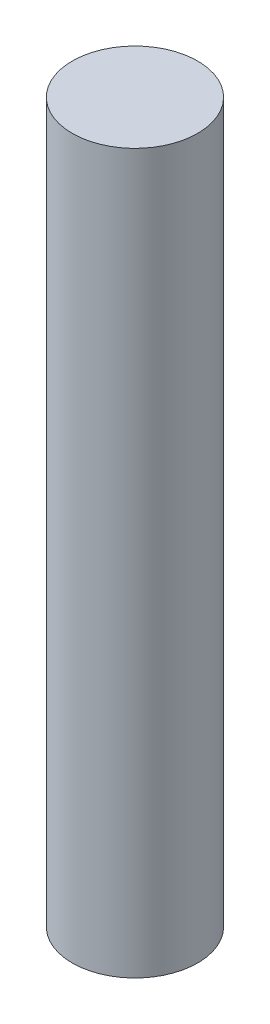
ISO-10303-21;
HEADER;
FILE_DESCRIPTION(('STEP AP214'),'2;1');
FILE_NAME('part.step','',(''),(''),'','','');
FILE_SCHEMA(('AUTOMOTIVE_DESIGN { 1 0 10303 214 1 1 1 1 }'));
ENDSEC;
DATA;
#1=APPLICATION_CONTEXT('core data for automotive mechanical design processes');
#2=APPLICATION_PROTOCOL_DEFINITION('international standard','automotive_design',2000,#1);
#3=PRODUCT_CONTEXT('',#1,'mechanical');
#4=PRODUCT('Part','Part','',(#3));
#5=PRODUCT_RELATED_PRODUCT_CATEGORY('part','',(#4));
#6=PRODUCT_DEFINITION_FORMATION('','',#4);
#7=PRODUCT_DEFINITION_CONTEXT('part definition',#1,'design');
#8=PRODUCT_DEFINITION('design','',#6,#7);
#9=PRODUCT_DEFINITION_SHAPE('','',#8);
#10=(LENGTH_UNIT() NAMED_UNIT(*) SI_UNIT(.MILLI.,.METRE.));
#11=(NAMED_UNIT(*) PLANE_ANGLE_UNIT() SI_UNIT($,.RADIAN.));
#12=(NAMED_UNIT(*) SI_UNIT($,.STERADIAN.) SOLID_ANGLE_UNIT());
#13=UNCERTAINTY_MEASURE_WITH_UNIT(LENGTH_MEASURE(1.E-05),#10,'distance_accuracy_value','');
#14=(GEOMETRIC_REPRESENTATION_CONTEXT(3) GLOBAL_UNCERTAINTY_ASSIGNED_CONTEXT((#13)) GLOBAL_UNIT_ASSIGNED_CONTEXT((#10,
#11,#12)) REPRESENTATION_CONTEXT('',''));
#15=CARTESIAN_POINT('',(0.,0.,0.));
#16=DIRECTION('',(0.,0.,1.));
#17=DIRECTION('',(1.,0.,0.));
#18=AXIS2_PLACEMENT_3D('',#15,#16,#17);
#19=CARTESIAN_POINT('',(0.,9.34,0.));
#20=DIRECTION('',(0.,-1.,0.));
#21=DIRECTION('',(0.,0.,-1.));
#22=AXIS2_PLACEMENT_3D('',#19,#20,#21);
#23=CYLINDRICAL_SURFACE('',#22,0.815);
#24=CARTESIAN_POINT('',(0.,9.34,0.));
#25=DIRECTION('',(0.,1.,0.));
#26=DIRECTION('',(0.,0.,1.));
#27=AXIS2_PLACEMENT_3D('',#24,#25,#26);
#28=CIRCLE('',#27,0.815);
#29=CARTESIAN_POINT('',(0.,9.34,0.815));
#30=VERTEX_POINT('',#29);
#31=EDGE_CURVE('E10',#30,#30,#28,.T.);
#32=ORIENTED_EDGE('',*,*,#31,.F.);
#33=EDGE_LOOP('',(#32));
#34=FACE_BOUND('',#33,.T.);
#35=CARTESIAN_POINT('',(0.,0.,0.));
#36=DIRECTION('',(0.,1.,0.));
#37=DIRECTION('',(0.,0.,1.));
#38=AXIS2_PLACEMENT_3D('',#35,#36,#37);
#39=CIRCLE('',#38,0.815);
#40=CARTESIAN_POINT('',(0.,0.,0.815));
#41=VERTEX_POINT('',#40);
#42=EDGE_CURVE('E46',#41,#41,#39,.T.);
#43=ORIENTED_EDGE('',*,*,#42,.T.);
#44=EDGE_LOOP('',(#43));
#45=FACE_BOUND('',#44,.T.);
#46=ADVANCED_FACE('F43',(#34,#45),#23,.T.);
#47=CARTESIAN_POINT('',(0.,9.34,0.));
#48=DIRECTION('',(0.,1.,0.));
#49=DIRECTION('',(0.,0.,1.));
#50=AXIS2_PLACEMENT_3D('',#47,#48,#49);
#51=PLANE('',#50);
#52=ORIENTED_EDGE('',*,*,#31,.T.);
#53=EDGE_LOOP('',(#52));
#54=FACE_BOUND('',#53,.T.);
#55=ADVANCED_FACE('F60',(#54),#51,.T.);
#56=CARTESIAN_POINT('',(0.,0.,0.));
#57=DIRECTION('',(0.,1.,0.));
#58=DIRECTION('',(0.,0.,1.));
#59=AXIS2_PLACEMENT_3D('',#56,#57,#58);
#60=PLANE('',#59);
#61=ORIENTED_EDGE('',*,*,#42,.F.);
#62=EDGE_LOOP('',(#61));
#63=FACE_BOUND('',#62,.T.);
#64=ADVANCED_FACE('F58',(#63),#60,.F.);
#65=CLOSED_SHELL('',(#46,#55,#64));
#66=MANIFOLD_SOLID_BREP('B2',#65);
#67=ADVANCED_BREP_SHAPE_REPRESENTATION('',(#18,#66),#14);
#68=SHAPE_DEFINITION_REPRESENTATION(#9,#67);
ENDSEC;
END-ISO-10303-21;
